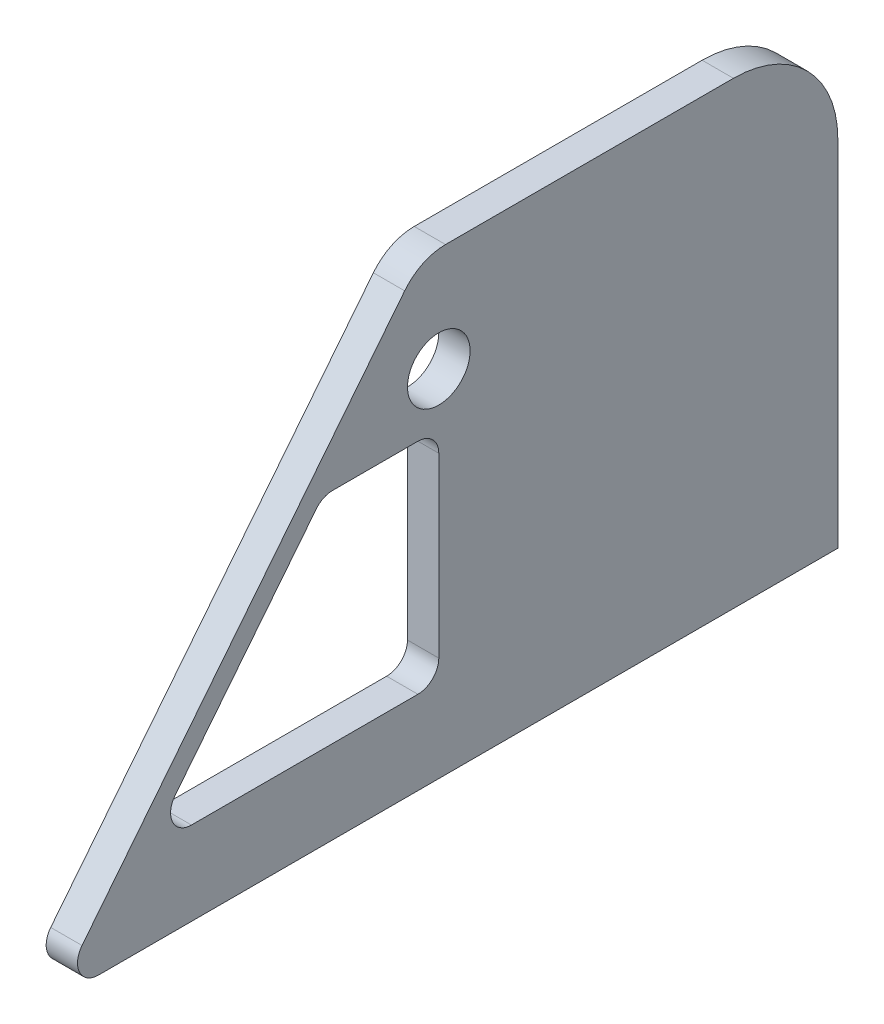
ISO-10303-21;
HEADER;
FILE_DESCRIPTION(('STEP AP214'),'2;1');
FILE_NAME('part.step','',(''),(''),'','','');
FILE_SCHEMA(('AUTOMOTIVE_DESIGN { 1 0 10303 214 1 1 1 1 }'));
ENDSEC;
DATA;
#1=APPLICATION_CONTEXT('core data for automotive mechanical design processes');
#2=APPLICATION_PROTOCOL_DEFINITION('international standard','automotive_design',2000,#1);
#3=PRODUCT_CONTEXT('',#1,'mechanical');
#4=PRODUCT('Part','Part','',(#3));
#5=PRODUCT_RELATED_PRODUCT_CATEGORY('part','',(#4));
#6=PRODUCT_DEFINITION_FORMATION('','',#4);
#7=PRODUCT_DEFINITION_CONTEXT('part definition',#1,'design');
#8=PRODUCT_DEFINITION('design','',#6,#7);
#9=PRODUCT_DEFINITION_SHAPE('','',#8);
#10=(LENGTH_UNIT() NAMED_UNIT(*) SI_UNIT(.MILLI.,.METRE.));
#11=(NAMED_UNIT(*) PLANE_ANGLE_UNIT() SI_UNIT($,.RADIAN.));
#12=(NAMED_UNIT(*) SI_UNIT($,.STERADIAN.) SOLID_ANGLE_UNIT());
#13=UNCERTAINTY_MEASURE_WITH_UNIT(LENGTH_MEASURE(1.E-05),#10,'distance_accuracy_value','');
#14=(GEOMETRIC_REPRESENTATION_CONTEXT(3) GLOBAL_UNCERTAINTY_ASSIGNED_CONTEXT((#13)) GLOBAL_UNIT_ASSIGNED_CONTEXT((#10,
#11,#12)) REPRESENTATION_CONTEXT('',''));
#15=CARTESIAN_POINT('',(0.,0.,0.));
#16=DIRECTION('',(0.,0.,1.));
#17=DIRECTION('',(1.,0.,0.));
#18=AXIS2_PLACEMENT_3D('',#15,#16,#17);
#19=CARTESIAN_POINT('',(-24.,0.,0.));
#20=DIRECTION('',(1.,0.,0.));
#21=DIRECTION('',(0.,0.,-1.));
#22=AXIS2_PLACEMENT_3D('',#19,#20,#21);
#23=PLANE('',#22);
#24=CARTESIAN_POINT('',(-24.,38.,-36.7665526420069));
#25=DIRECTION('',(1.,0.,0.));
#26=DIRECTION('',(0.,0.,-1.));
#27=AXIS2_PLACEMENT_3D('',#24,#25,#26);
#28=CIRCLE('',#27,3.);
#29=CARTESIAN_POINT('',(-24.,38.,-39.7665526420069));
#30=VERTEX_POINT('',#29);
#31=EDGE_CURVE('E181',#30,#30,#28,.T.);
#32=ORIENTED_EDGE('',*,*,#31,.F.);
#33=EDGE_LOOP('',(#32));
#34=FACE_BOUND('',#33,.T.);
#35=DIRECTION('',(0.,0.782601054175649,-0.622523565821538));
#36=VECTOR('',#35,1.);
#37=CARTESIAN_POINT('',(-24.,4.,0.));
#38=LINE('',#37,#36);
#39=CARTESIAN_POINT('',(-24.,7.24504713164308,-2.58128749107972));
#40=VERTEX_POINT('',#39);
#41=CARTESIAN_POINT('',(-24.,46.1126178291077,-33.4986732731538));
#42=VERTEX_POINT('',#41);
#43=EDGE_CURVE('E253',#40,#42,#38,.T.);
#44=ORIENTED_EDGE('',*,*,#43,.F.);
#45=CARTESIAN_POINT('',(-24.,6.,-4.14648959943101));
#46=DIRECTION('',(1.,0.,0.));
#47=DIRECTION('',(0.,0.,-1.));
#48=AXIS2_PLACEMENT_3D('',#45,#46,#47);
#49=CIRCLE('',#48,2.);
#50=CARTESIAN_POINT('',(-24.,4.,-4.14648959943101));
#51=VERTEX_POINT('',#50);
#52=EDGE_CURVE('E54',#40,#51,#49,.T.);
#53=ORIENTED_EDGE('',*,*,#52,.T.);
#54=DIRECTION('',(0.,0.,1.));
#55=VECTOR('',#54,1.);
#56=CARTESIAN_POINT('',(-24.,4.,-74.9999999999999));
#57=LINE('',#56,#55);
#58=CARTESIAN_POINT('',(-24.,4.,-75.));
#59=VERTEX_POINT('',#58);
#60=EDGE_CURVE('E159',#59,#51,#57,.T.);
#61=ORIENTED_EDGE('',*,*,#60,.F.);
#62=DIRECTION('',(0.,1.,0.));
#63=VECTOR('',#62,1.);
#64=CARTESIAN_POINT('',(-24.,4.,-74.9999999999999));
#65=LINE('',#64,#63);
#66=CARTESIAN_POINT('',(-24.,38.,-74.9999999999999));
#67=VERTEX_POINT('',#66);
#68=EDGE_CURVE('E157',#59,#67,#65,.T.);
#69=ORIENTED_EDGE('',*,*,#68,.T.);
#70=CARTESIAN_POINT('',(-24.,38.,-65.));
#71=DIRECTION('',(1.,0.,0.));
#72=DIRECTION('',(0.,0.,-1.));
#73=AXIS2_PLACEMENT_3D('',#70,#71,#72);
#74=CIRCLE('',#73,10.);
#75=CARTESIAN_POINT('',(-24.,48.,-65.));
#76=VERTEX_POINT('',#75);
#77=EDGE_CURVE('E162',#67,#76,#74,.T.);
#78=ORIENTED_EDGE('',*,*,#77,.T.);
#79=DIRECTION('',(0.,0.,1.));
#80=VECTOR('',#79,1.);
#81=CARTESIAN_POINT('',(-24.,48.,-74.9999999999999));
#82=LINE('',#81,#80);
#83=CARTESIAN_POINT('',(-24.,48.,-37.411678544032));
#84=VERTEX_POINT('',#83);
#85=EDGE_CURVE('E170',#76,#84,#82,.T.);
#86=ORIENTED_EDGE('',*,*,#85,.T.);
#87=CARTESIAN_POINT('',(-24.,43.,-37.411678544032));
#88=DIRECTION('',(1.,0.,0.));
#89=DIRECTION('',(0.,0.,-1.));
#90=AXIS2_PLACEMENT_3D('',#87,#88,#89);
#91=CIRCLE('',#90,5.);
#92=EDGE_CURVE('E186',#84,#42,#91,.T.);
#93=ORIENTED_EDGE('',*,*,#92,.T.);
#94=EDGE_LOOP('',(#44,#53,#61,#69,#78,#86,#93));
#95=FACE_BOUND('',#94,.T.);
#96=DIRECTION('',(0.,0.,-1.));
#97=VECTOR('',#96,1.);
#98=CARTESIAN_POINT('',(-24.,33.,0.));
#99=LINE('',#98,#97);
#100=CARTESIAN_POINT('',(-24.,33.,-26.5884337443165));
#101=VERTEX_POINT('',#100);
#102=CARTESIAN_POINT('',(-24.,33.,-34.7665526420069));
#103=VERTEX_POINT('',#102);
#104=EDGE_CURVE('E262',#101,#103,#99,.T.);
#105=ORIENTED_EDGE('',*,*,#104,.T.);
#106=CARTESIAN_POINT('',(-24.,31.,-34.7665526420069));
#107=DIRECTION('',(1.,0.,0.));
#108=DIRECTION('',(0.,0.,-1.));
#109=AXIS2_PLACEMENT_3D('',#106,#107,#108);
#110=CIRCLE('',#109,2.);
#111=CARTESIAN_POINT('',(-24.,31.,-36.7665526420069));
#112=VERTEX_POINT('',#111);
#113=EDGE_CURVE('E305',#103,#112,#110,.F.);
#114=ORIENTED_EDGE('',*,*,#113,.T.);
#115=DIRECTION('',(0.,-1.,0.));
#116=VECTOR('',#115,1.);
#117=CARTESIAN_POINT('',(-24.,0.,-36.7665526420069));
#118=LINE('',#117,#116);
#119=CARTESIAN_POINT('',(-24.,14.,-36.7665526420069));
#120=VERTEX_POINT('',#119);
#121=EDGE_CURVE('E265',#112,#120,#118,.T.);
#122=ORIENTED_EDGE('',*,*,#121,.T.);
#123=CARTESIAN_POINT('',(-24.,14.,-34.7665526420069));
#124=DIRECTION('',(1.,0.,0.));
#125=DIRECTION('',(0.,0.,-1.));
#126=AXIS2_PLACEMENT_3D('',#123,#124,#125);
#127=CIRCLE('',#126,2.);
#128=CARTESIAN_POINT('',(-24.,12.,-34.7665526420069));
#129=VERTEX_POINT('',#128);
#130=EDGE_CURVE('E273',#120,#129,#127,.F.);
#131=ORIENTED_EDGE('',*,*,#130,.T.);
#132=DIRECTION('',(0.,0.,1.));
#133=VECTOR('',#132,1.);
#134=CARTESIAN_POINT('',(-24.,12.,0.));
#135=LINE('',#134,#133);
#136=CARTESIAN_POINT('',(-24.,12.,-13.0657064715893));
#137=VERTEX_POINT('',#136);
#138=EDGE_CURVE('E268',#129,#137,#135,.T.);
#139=ORIENTED_EDGE('',*,*,#138,.T.);
#140=CARTESIAN_POINT('',(-24.,14.,-13.0657064715893));
#141=DIRECTION('',(1.,0.,0.));
#142=DIRECTION('',(0.,0.,-1.));
#143=AXIS2_PLACEMENT_3D('',#140,#141,#142);
#144=CIRCLE('',#143,2.);
#145=CARTESIAN_POINT('',(-24.,15.2450471316431,-11.500504363238));
#146=VERTEX_POINT('',#145);
#147=EDGE_CURVE('E271',#137,#146,#144,.F.);
#148=ORIENTED_EDGE('',*,*,#147,.T.);
#149=DIRECTION('',(0.,0.782601054175649,-0.622523565821538));
#150=VECTOR('',#149,1.);
#151=CARTESIAN_POINT('',(-24.,0.305095228369575,0.38354828709318));
#152=LINE('',#151,#150);
#153=CARTESIAN_POINT('',(-24.,32.2450471316431,-25.0232316359652));
#154=VERTEX_POINT('',#153);
#155=EDGE_CURVE('E153',#146,#154,#152,.T.);
#156=ORIENTED_EDGE('',*,*,#155,.T.);
#157=CARTESIAN_POINT('',(-24.,31.,-26.5884337443165));
#158=DIRECTION('',(1.,0.,0.));
#159=DIRECTION('',(0.,0.,-1.));
#160=AXIS2_PLACEMENT_3D('',#157,#158,#159);
#161=CIRCLE('',#160,2.);
#162=EDGE_CURVE('E309',#154,#101,#161,.F.);
#163=ORIENTED_EDGE('',*,*,#162,.T.);
#164=EDGE_LOOP('',(#105,#114,#122,#131,#139,#148,#156,#163));
#165=FACE_BOUND('',#164,.T.);
#166=ADVANCED_FACE('F32',(#34,#95,#165),#23,.T.);
#167=CARTESIAN_POINT('',(-27.,75.,0.));
#168=DIRECTION('',(1.,0.,0.));
#169=DIRECTION('',(0.,0.,-1.));
#170=AXIS2_PLACEMENT_3D('',#167,#168,#169);
#171=PLANE('',#170);
#172=CARTESIAN_POINT('',(-27.,38.,-36.7665526420069));
#173=DIRECTION('',(1.,0.,0.));
#174=DIRECTION('',(0.,0.,-1.));
#175=AXIS2_PLACEMENT_3D('',#172,#173,#174);
#176=CIRCLE('',#175,3.);
#177=CARTESIAN_POINT('',(-27.,38.,-39.7665526420069));
#178=VERTEX_POINT('',#177);
#179=EDGE_CURVE('E164',#178,#178,#176,.F.);
#180=ORIENTED_EDGE('',*,*,#179,.F.);
#181=EDGE_LOOP('',(#180));
#182=FACE_BOUND('',#181,.T.);
#183=DIRECTION('',(0.,0.,1.));
#184=VECTOR('',#183,1.);
#185=CARTESIAN_POINT('',(-27.,4.,0.));
#186=LINE('',#185,#184);
#187=CARTESIAN_POINT('',(-27.,4.,-75.));
#188=VERTEX_POINT('',#187);
#189=CARTESIAN_POINT('',(-27.,4.,-4.14648959943101));
#190=VERTEX_POINT('',#189);
#191=EDGE_CURVE('E140',#188,#190,#186,.T.);
#192=ORIENTED_EDGE('',*,*,#191,.T.);
#193=CARTESIAN_POINT('',(-27.,6.,-4.14648959943101));
#194=DIRECTION('',(1.,0.,0.));
#195=DIRECTION('',(0.,0.,-1.));
#196=AXIS2_PLACEMENT_3D('',#193,#194,#195);
#197=CIRCLE('',#196,2.);
#198=CARTESIAN_POINT('',(-27.,7.24504713164308,-2.58128749107972));
#199=VERTEX_POINT('',#198);
#200=EDGE_CURVE('E11',#190,#199,#197,.F.);
#201=ORIENTED_EDGE('',*,*,#200,.T.);
#202=DIRECTION('',(0.,0.782601054175649,-0.622523565821538));
#203=VECTOR('',#202,1.);
#204=CARTESIAN_POINT('',(-27.,1.55014236001265,1.94875039544448));
#205=LINE('',#204,#203);
#206=CARTESIAN_POINT('',(-27.,46.1126178291077,-33.4986732731538));
#207=VERTEX_POINT('',#206);
#208=EDGE_CURVE('E178',#199,#207,#205,.T.);
#209=ORIENTED_EDGE('',*,*,#208,.T.);
#210=CARTESIAN_POINT('',(-27.,43.,-37.411678544032));
#211=DIRECTION('',(1.,0.,0.));
#212=DIRECTION('',(0.,0.,-1.));
#213=AXIS2_PLACEMENT_3D('',#210,#211,#212);
#214=CIRCLE('',#213,5.);
#215=CARTESIAN_POINT('',(-27.,48.,-37.411678544032));
#216=VERTEX_POINT('',#215);
#217=EDGE_CURVE('E147',#207,#216,#214,.F.);
#218=ORIENTED_EDGE('',*,*,#217,.T.);
#219=DIRECTION('',(0.,0.,1.));
#220=VECTOR('',#219,1.);
#221=CARTESIAN_POINT('',(-27.,48.,0.));
#222=LINE('',#221,#220);
#223=CARTESIAN_POINT('',(-27.,48.,-65.));
#224=VERTEX_POINT('',#223);
#225=EDGE_CURVE('E254',#224,#216,#222,.T.);
#226=ORIENTED_EDGE('',*,*,#225,.F.);
#227=CARTESIAN_POINT('',(-27.,38.,-65.));
#228=DIRECTION('',(1.,0.,0.));
#229=DIRECTION('',(0.,0.,-1.));
#230=AXIS2_PLACEMENT_3D('',#227,#228,#229);
#231=CIRCLE('',#230,10.);
#232=CARTESIAN_POINT('',(-27.,38.,-75.));
#233=VERTEX_POINT('',#232);
#234=EDGE_CURVE('E143',#224,#233,#231,.F.);
#235=ORIENTED_EDGE('',*,*,#234,.T.);
#236=DIRECTION('',(0.,-1.,0.));
#237=VECTOR('',#236,1.);
#238=CARTESIAN_POINT('',(-27.,75.,-75.));
#239=LINE('',#238,#237);
#240=EDGE_CURVE('E137',#233,#188,#239,.T.);
#241=ORIENTED_EDGE('',*,*,#240,.T.);
#242=EDGE_LOOP('',(#192,#201,#209,#218,#226,#235,#241));
#243=FACE_BOUND('',#242,.T.);
#244=DIRECTION('',(0.,0.,1.));
#245=VECTOR('',#244,1.);
#246=CARTESIAN_POINT('',(-27.,12.,0.));
#247=LINE('',#246,#245);
#248=CARTESIAN_POINT('',(-27.,12.,-34.7665526420069));
#249=VERTEX_POINT('',#248);
#250=CARTESIAN_POINT('',(-27.,12.,-13.0657064715893));
#251=VERTEX_POINT('',#250);
#252=EDGE_CURVE('E494',#249,#251,#247,.T.);
#253=ORIENTED_EDGE('',*,*,#252,.F.);
#254=CARTESIAN_POINT('',(-27.,14.,-34.7665526420069));
#255=DIRECTION('',(1.,0.,0.));
#256=DIRECTION('',(0.,0.,-1.));
#257=AXIS2_PLACEMENT_3D('',#254,#255,#256);
#258=CIRCLE('',#257,2.);
#259=CARTESIAN_POINT('',(-27.,14.,-36.7665526420069));
#260=VERTEX_POINT('',#259);
#261=EDGE_CURVE('E287',#249,#260,#258,.T.);
#262=ORIENTED_EDGE('',*,*,#261,.T.);
#263=DIRECTION('',(0.,-1.,0.));
#264=VECTOR('',#263,1.);
#265=CARTESIAN_POINT('',(-27.,75.,-36.7665526420069));
#266=LINE('',#265,#264);
#267=CARTESIAN_POINT('',(-27.,31.,-36.7665526420069));
#268=VERTEX_POINT('',#267);
#269=EDGE_CURVE('E180',#268,#260,#266,.T.);
#270=ORIENTED_EDGE('',*,*,#269,.F.);
#271=CARTESIAN_POINT('',(-27.,31.,-34.7665526420069));
#272=DIRECTION('',(1.,0.,0.));
#273=DIRECTION('',(0.,0.,-1.));
#274=AXIS2_PLACEMENT_3D('',#271,#272,#273);
#275=CIRCLE('',#274,2.);
#276=CARTESIAN_POINT('',(-27.,33.,-34.7665526420069));
#277=VERTEX_POINT('',#276);
#278=EDGE_CURVE('E307',#268,#277,#275,.T.);
#279=ORIENTED_EDGE('',*,*,#278,.T.);
#280=DIRECTION('',(0.,0.,-1.));
#281=VECTOR('',#280,1.);
#282=CARTESIAN_POINT('',(-27.,33.,0.));
#283=LINE('',#282,#281);
#284=CARTESIAN_POINT('',(-27.,33.,-26.5884337443165));
#285=VERTEX_POINT('',#284);
#286=EDGE_CURVE('E493',#285,#277,#283,.T.);
#287=ORIENTED_EDGE('',*,*,#286,.F.);
#288=CARTESIAN_POINT('',(-27.,31.,-26.5884337443165));
#289=DIRECTION('',(1.,0.,0.));
#290=DIRECTION('',(0.,0.,-1.));
#291=AXIS2_PLACEMENT_3D('',#288,#289,#290);
#292=CIRCLE('',#291,2.);
#293=CARTESIAN_POINT('',(-27.,32.2450471316431,-25.0232316359652));
#294=VERTEX_POINT('',#293);
#295=EDGE_CURVE('E311',#285,#294,#292,.T.);
#296=ORIENTED_EDGE('',*,*,#295,.T.);
#297=DIRECTION('',(0.,0.782601054175649,-0.622523565821538));
#298=VECTOR('',#297,1.);
#299=CARTESIAN_POINT('',(-27.,46.2399259781324,-36.1555216274908));
#300=LINE('',#299,#298);
#301=CARTESIAN_POINT('',(-27.,15.2450471316431,-11.500504363238));
#302=VERTEX_POINT('',#301);
#303=EDGE_CURVE('E498',#302,#294,#300,.T.);
#304=ORIENTED_EDGE('',*,*,#303,.F.);
#305=CARTESIAN_POINT('',(-27.,14.,-13.0657064715893));
#306=DIRECTION('',(1.,0.,0.));
#307=DIRECTION('',(0.,0.,-1.));
#308=AXIS2_PLACEMENT_3D('',#305,#306,#307);
#309=CIRCLE('',#308,2.);
#310=EDGE_CURVE('E314',#302,#251,#309,.T.);
#311=ORIENTED_EDGE('',*,*,#310,.T.);
#312=EDGE_LOOP('',(#253,#262,#270,#279,#287,#296,#304,#311));
#313=FACE_BOUND('',#312,.T.);
#314=ADVANCED_FACE('F138',(#182,#243,#313),#171,.F.);
#315=CARTESIAN_POINT('',(-24.,4.,0.));
#316=DIRECTION('',(0.,1.,0.));
#317=DIRECTION('',(0.,0.,1.));
#318=AXIS2_PLACEMENT_3D('',#315,#316,#317);
#319=PLANE('',#318);
#320=ORIENTED_EDGE('',*,*,#60,.T.);
#321=DIRECTION('',(1.,0.,0.));
#322=VECTOR('',#321,1.);
#323=CARTESIAN_POINT('',(-27.,4.,-4.14648959943101));
#324=LINE('',#323,#322);
#325=EDGE_CURVE('E40',#51,#190,#324,.F.);
#326=ORIENTED_EDGE('',*,*,#325,.T.);
#327=ORIENTED_EDGE('',*,*,#191,.F.);
#328=DIRECTION('',(-1.,0.,0.));
#329=VECTOR('',#328,1.);
#330=CARTESIAN_POINT('',(-30.,4.,-75.));
#331=LINE('',#330,#329);
#332=EDGE_CURVE('E151',#59,#188,#331,.T.);
#333=ORIENTED_EDGE('',*,*,#332,.F.);
#334=EDGE_LOOP('',(#320,#326,#327,#333));
#335=FACE_BOUND('',#334,.T.);
#336=ADVANCED_FACE('F150',(#335),#319,.F.);
#337=CARTESIAN_POINT('',(0.,48.,0.));
#338=DIRECTION('',(0.,-1.,0.));
#339=DIRECTION('',(0.,0.,-1.));
#340=AXIS2_PLACEMENT_3D('',#337,#338,#339);
#341=PLANE('',#340);
#342=DIRECTION('',(1.,0.,0.));
#343=VECTOR('',#342,1.);
#344=CARTESIAN_POINT('',(0.,48.,-65.));
#345=LINE('',#344,#343);
#346=EDGE_CURVE('E158',#76,#224,#345,.F.);
#347=ORIENTED_EDGE('',*,*,#346,.T.);
#348=ORIENTED_EDGE('',*,*,#225,.T.);
#349=DIRECTION('',(-1.,0.,0.));
#350=VECTOR('',#349,1.);
#351=CARTESIAN_POINT('',(-24.,48.,-37.411678544032));
#352=LINE('',#351,#350);
#353=EDGE_CURVE('E182',#216,#84,#352,.F.);
#354=ORIENTED_EDGE('',*,*,#353,.T.);
#355=ORIENTED_EDGE('',*,*,#85,.F.);
#356=EDGE_LOOP('',(#347,#348,#354,#355));
#357=FACE_BOUND('',#356,.T.);
#358=ADVANCED_FACE('F202',(#357),#341,.F.);
#359=CARTESIAN_POINT('',(-30.,38.,-65.));
#360=DIRECTION('',(1.,0.,0.));
#361=DIRECTION('',(0.,0.,-1.));
#362=AXIS2_PLACEMENT_3D('',#359,#360,#361);
#363=CYLINDRICAL_SURFACE('',#362,10.);
#364=ORIENTED_EDGE('',*,*,#234,.F.);
#365=ORIENTED_EDGE('',*,*,#346,.F.);
#366=ORIENTED_EDGE('',*,*,#77,.F.);
#367=DIRECTION('',(1.,0.,0.));
#368=VECTOR('',#367,1.);
#369=CARTESIAN_POINT('',(-30.,38.,-75.));
#370=LINE('',#369,#368);
#371=EDGE_CURVE('E242',#233,#67,#370,.T.);
#372=ORIENTED_EDGE('',*,*,#371,.F.);
#373=EDGE_LOOP('',(#364,#365,#366,#372));
#374=FACE_BOUND('',#373,.T.);
#375=ADVANCED_FACE('F212',(#374),#363,.T.);
#376=CARTESIAN_POINT('',(-30.,4.,-75.));
#377=DIRECTION('',(0.,0.,1.));
#378=DIRECTION('',(1.,0.,0.));
#379=AXIS2_PLACEMENT_3D('',#376,#377,#378);
#380=PLANE('',#379);
#381=ORIENTED_EDGE('',*,*,#332,.T.);
#382=ORIENTED_EDGE('',*,*,#240,.F.);
#383=ORIENTED_EDGE('',*,*,#371,.T.);
#384=ORIENTED_EDGE('',*,*,#68,.F.);
#385=EDGE_LOOP('',(#381,#382,#383,#384));
#386=FACE_BOUND('',#385,.T.);
#387=ADVANCED_FACE('F155',(#386),#380,.F.);
#388=CARTESIAN_POINT('',(44.,38.,-36.7665526420069));
#389=DIRECTION('',(-1.,0.,0.));
#390=DIRECTION('',(0.,0.,1.));
#391=AXIS2_PLACEMENT_3D('',#388,#389,#390);
#392=CYLINDRICAL_SURFACE('',#391,3.);
#393=ORIENTED_EDGE('',*,*,#179,.T.);
#394=EDGE_LOOP('',(#393));
#395=FACE_BOUND('',#394,.T.);
#396=ORIENTED_EDGE('',*,*,#31,.T.);
#397=EDGE_LOOP('',(#396));
#398=FACE_BOUND('',#397,.T.);
#399=ADVANCED_FACE('F348',(#395,#398),#392,.F.);
#400=CARTESIAN_POINT('',(0.,43.,-37.411678544032));
#401=DIRECTION('',(1.,0.,0.));
#402=DIRECTION('',(0.,0.,-1.));
#403=AXIS2_PLACEMENT_3D('',#400,#401,#402);
#404=CYLINDRICAL_SURFACE('',#403,5.);
#405=ORIENTED_EDGE('',*,*,#217,.F.);
#406=DIRECTION('',(-1.,0.,0.));
#407=VECTOR('',#406,1.);
#408=CARTESIAN_POINT('',(-30.,46.1126178291077,-33.4986732731538));
#409=LINE('',#408,#407);
#410=EDGE_CURVE('E185',#42,#207,#409,.T.);
#411=ORIENTED_EDGE('',*,*,#410,.F.);
#412=ORIENTED_EDGE('',*,*,#92,.F.);
#413=ORIENTED_EDGE('',*,*,#353,.F.);
#414=EDGE_LOOP('',(#405,#411,#412,#413));
#415=FACE_BOUND('',#414,.T.);
#416=ADVANCED_FACE('F215',(#415),#404,.T.);
#417=CARTESIAN_POINT('',(0.,1.55014236001265,1.94875039544448));
#418=DIRECTION('',(0.,0.622523565821538,0.782601054175649));
#419=DIRECTION('',(0.,-0.782601054175649,0.622523565821538));
#420=AXIS2_PLACEMENT_3D('',#417,#418,#419);
#421=PLANE('',#420);
#422=ORIENTED_EDGE('',*,*,#208,.F.);
#423=DIRECTION('',(1.,0.,0.));
#424=VECTOR('',#423,1.);
#425=CARTESIAN_POINT('',(-24.,7.24504713164308,-2.58128749107971));
#426=LINE('',#425,#424);
#427=EDGE_CURVE('E316',#199,#40,#426,.T.);
#428=ORIENTED_EDGE('',*,*,#427,.T.);
#429=ORIENTED_EDGE('',*,*,#43,.T.);
#430=ORIENTED_EDGE('',*,*,#410,.T.);
#431=EDGE_LOOP('',(#422,#428,#429,#430));
#432=FACE_BOUND('',#431,.T.);
#433=ADVANCED_FACE('F217',(#432),#421,.T.);
#434=CARTESIAN_POINT('',(-95.,12.,0.));
#435=DIRECTION('',(0.,1.,0.));
#436=DIRECTION('',(0.,0.,1.));
#437=AXIS2_PLACEMENT_3D('',#434,#435,#436);
#438=PLANE('',#437);
#439=ORIENTED_EDGE('',*,*,#138,.F.);
#440=DIRECTION('',(1.,0.,0.));
#441=VECTOR('',#440,1.);
#442=CARTESIAN_POINT('',(-27.,12.,-34.7665526420069));
#443=LINE('',#442,#441);
#444=EDGE_CURVE('E278',#129,#249,#443,.F.);
#445=ORIENTED_EDGE('',*,*,#444,.T.);
#446=ORIENTED_EDGE('',*,*,#252,.T.);
#447=DIRECTION('',(1.,0.,0.));
#448=VECTOR('',#447,1.);
#449=CARTESIAN_POINT('',(-24.,12.,-13.0657064715893));
#450=LINE('',#449,#448);
#451=EDGE_CURVE('E281',#251,#137,#450,.T.);
#452=ORIENTED_EDGE('',*,*,#451,.T.);
#453=EDGE_LOOP('',(#439,#445,#446,#452));
#454=FACE_BOUND('',#453,.T.);
#455=ADVANCED_FACE('F214',(#454),#438,.T.);
#456=CARTESIAN_POINT('',(-95.,0.305095228369575,0.38354828709318));
#457=DIRECTION('',(0.,-0.622523565821538,-0.782601054175649));
#458=DIRECTION('',(0.,0.782601054175649,-0.622523565821538));
#459=AXIS2_PLACEMENT_3D('',#456,#457,#458);
#460=PLANE('',#459);
#461=ORIENTED_EDGE('',*,*,#303,.T.);
#462=DIRECTION('',(1.,0.,0.));
#463=VECTOR('',#462,1.);
#464=CARTESIAN_POINT('',(-24.,32.2450471316431,-25.0232316359652));
#465=LINE('',#464,#463);
#466=EDGE_CURVE('E300',#294,#154,#465,.T.);
#467=ORIENTED_EDGE('',*,*,#466,.T.);
#468=ORIENTED_EDGE('',*,*,#155,.F.);
#469=DIRECTION('',(1.,0.,0.));
#470=VECTOR('',#469,1.);
#471=CARTESIAN_POINT('',(-27.,15.2450471316431,-11.500504363238));
#472=LINE('',#471,#470);
#473=EDGE_CURVE('E298',#146,#302,#472,.F.);
#474=ORIENTED_EDGE('',*,*,#473,.T.);
#475=EDGE_LOOP('',(#461,#467,#468,#474));
#476=FACE_BOUND('',#475,.T.);
#477=ADVANCED_FACE('F395',(#476),#460,.T.);
#478=CARTESIAN_POINT('',(-95.,33.,0.));
#479=DIRECTION('',(0.,-1.,0.));
#480=DIRECTION('',(0.,0.,-1.));
#481=AXIS2_PLACEMENT_3D('',#478,#479,#480);
#482=PLANE('',#481);
#483=ORIENTED_EDGE('',*,*,#286,.T.);
#484=DIRECTION('',(1.,0.,0.));
#485=VECTOR('',#484,1.);
#486=CARTESIAN_POINT('',(-24.,33.,-34.7665526420069));
#487=LINE('',#486,#485);
#488=EDGE_CURVE('E290',#277,#103,#487,.T.);
#489=ORIENTED_EDGE('',*,*,#488,.T.);
#490=ORIENTED_EDGE('',*,*,#104,.F.);
#491=DIRECTION('',(1.,0.,0.));
#492=VECTOR('',#491,1.);
#493=CARTESIAN_POINT('',(-27.,33.,-26.5884337443165));
#494=LINE('',#493,#492);
#495=EDGE_CURVE('E288',#101,#285,#494,.F.);
#496=ORIENTED_EDGE('',*,*,#495,.T.);
#497=EDGE_LOOP('',(#483,#489,#490,#496));
#498=FACE_BOUND('',#497,.T.);
#499=ADVANCED_FACE('F404',(#498),#482,.T.);
#500=CARTESIAN_POINT('',(-95.,0.,-36.7665526420069));
#501=DIRECTION('',(0.,0.,1.));
#502=DIRECTION('',(1.,0.,0.));
#503=AXIS2_PLACEMENT_3D('',#500,#501,#502);
#504=PLANE('',#503);
#505=ORIENTED_EDGE('',*,*,#269,.T.);
#506=DIRECTION('',(1.,0.,0.));
#507=VECTOR('',#506,1.);
#508=CARTESIAN_POINT('',(-24.,14.,-36.7665526420069));
#509=LINE('',#508,#507);
#510=EDGE_CURVE('E292',#260,#120,#509,.T.);
#511=ORIENTED_EDGE('',*,*,#510,.T.);
#512=ORIENTED_EDGE('',*,*,#121,.F.);
#513=DIRECTION('',(1.,0.,0.));
#514=VECTOR('',#513,1.);
#515=CARTESIAN_POINT('',(-27.,31.,-36.7665526420069));
#516=LINE('',#515,#514);
#517=EDGE_CURVE('E491',#112,#268,#516,.F.);
#518=ORIENTED_EDGE('',*,*,#517,.T.);
#519=EDGE_LOOP('',(#505,#511,#512,#518));
#520=FACE_BOUND('',#519,.T.);
#521=ADVANCED_FACE('F346',(#520),#504,.T.);
#522=CARTESIAN_POINT('',(-95.,14.,-34.7665526420069));
#523=DIRECTION('',(-1.,0.,0.));
#524=DIRECTION('',(0.,0.,1.));
#525=AXIS2_PLACEMENT_3D('',#522,#523,#524);
#526=CYLINDRICAL_SURFACE('',#525,2.);
#527=ORIENTED_EDGE('',*,*,#261,.F.);
#528=ORIENTED_EDGE('',*,*,#444,.F.);
#529=ORIENTED_EDGE('',*,*,#130,.F.);
#530=ORIENTED_EDGE('',*,*,#510,.F.);
#531=EDGE_LOOP('',(#527,#528,#529,#530));
#532=FACE_BOUND('',#531,.T.);
#533=ADVANCED_FACE('F284',(#532),#526,.F.);
#534=CARTESIAN_POINT('',(-95.,31.,-34.7665526420069));
#535=DIRECTION('',(-1.,0.,0.));
#536=DIRECTION('',(0.,0.,1.));
#537=AXIS2_PLACEMENT_3D('',#534,#535,#536);
#538=CYLINDRICAL_SURFACE('',#537,2.);
#539=ORIENTED_EDGE('',*,*,#278,.F.);
#540=ORIENTED_EDGE('',*,*,#517,.F.);
#541=ORIENTED_EDGE('',*,*,#113,.F.);
#542=ORIENTED_EDGE('',*,*,#488,.F.);
#543=EDGE_LOOP('',(#539,#540,#541,#542));
#544=FACE_BOUND('',#543,.T.);
#545=ADVANCED_FACE('F336',(#544),#538,.F.);
#546=CARTESIAN_POINT('',(-95.,31.,-26.5884337443165));
#547=DIRECTION('',(-1.,0.,0.));
#548=DIRECTION('',(0.,0.,1.));
#549=AXIS2_PLACEMENT_3D('',#546,#547,#548);
#550=CYLINDRICAL_SURFACE('',#549,2.);
#551=ORIENTED_EDGE('',*,*,#295,.F.);
#552=ORIENTED_EDGE('',*,*,#495,.F.);
#553=ORIENTED_EDGE('',*,*,#162,.F.);
#554=ORIENTED_EDGE('',*,*,#466,.F.);
#555=EDGE_LOOP('',(#551,#552,#553,#554));
#556=FACE_BOUND('',#555,.T.);
#557=ADVANCED_FACE('F331',(#556),#550,.F.);
#558=CARTESIAN_POINT('',(-95.,14.,-13.0657064715893));
#559=DIRECTION('',(-1.,0.,0.));
#560=DIRECTION('',(0.,0.,1.));
#561=AXIS2_PLACEMENT_3D('',#558,#559,#560);
#562=CYLINDRICAL_SURFACE('',#561,2.);
#563=ORIENTED_EDGE('',*,*,#310,.F.);
#564=ORIENTED_EDGE('',*,*,#473,.F.);
#565=ORIENTED_EDGE('',*,*,#147,.F.);
#566=ORIENTED_EDGE('',*,*,#451,.F.);
#567=EDGE_LOOP('',(#563,#564,#565,#566));
#568=FACE_BOUND('',#567,.T.);
#569=ADVANCED_FACE('F327',(#568),#562,.F.);
#570=CARTESIAN_POINT('',(0.,6.,-4.14648959943101));
#571=DIRECTION('',(-1.,0.,0.));
#572=DIRECTION('',(0.,0.,1.));
#573=AXIS2_PLACEMENT_3D('',#570,#571,#572);
#574=CYLINDRICAL_SURFACE('',#573,2.);
#575=ORIENTED_EDGE('',*,*,#200,.F.);
#576=ORIENTED_EDGE('',*,*,#325,.F.);
#577=ORIENTED_EDGE('',*,*,#52,.F.);
#578=ORIENTED_EDGE('',*,*,#427,.F.);
#579=EDGE_LOOP('',(#575,#576,#577,#578));
#580=FACE_BOUND('',#579,.T.);
#581=ADVANCED_FACE('F34',(#580),#574,.T.);
#582=CLOSED_SHELL('',(#166,#314,#336,#358,#375,#387,#399,#416,#433,#455,#477,#499,#521,#533,
#545,#557,#569,#581));
#583=MANIFOLD_SOLID_BREP('B2',#582);
#584=ADVANCED_BREP_SHAPE_REPRESENTATION('',(#18,#583),#14);
#585=SHAPE_DEFINITION_REPRESENTATION(#9,#584);
ENDSEC;
END-ISO-10303-21;
